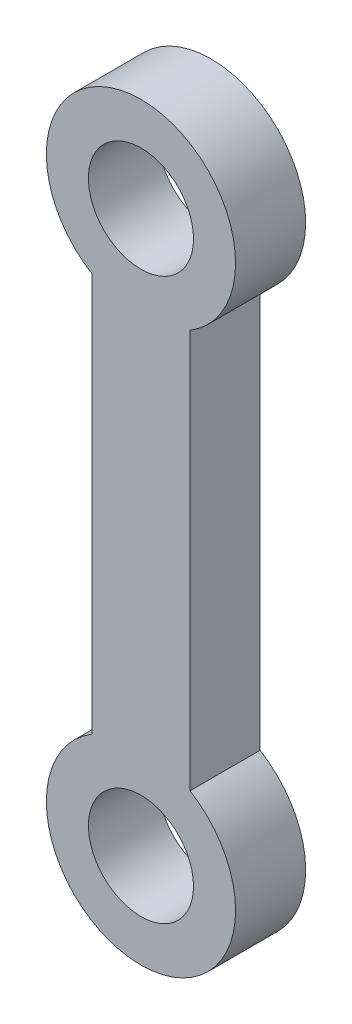
ISO-10303-21;
HEADER;
FILE_DESCRIPTION(('STEP AP214'),'2;1');
FILE_NAME('part.step','',(''),(''),'','','');
FILE_SCHEMA(('AUTOMOTIVE_DESIGN { 1 0 10303 214 1 1 1 1 }'));
ENDSEC;
DATA;
#1=APPLICATION_CONTEXT('core data for automotive mechanical design processes');
#2=APPLICATION_PROTOCOL_DEFINITION('international standard','automotive_design',2000,#1);
#3=PRODUCT_CONTEXT('',#1,'mechanical');
#4=PRODUCT('Part','Part','',(#3));
#5=PRODUCT_RELATED_PRODUCT_CATEGORY('part','',(#4));
#6=PRODUCT_DEFINITION_FORMATION('','',#4);
#7=PRODUCT_DEFINITION_CONTEXT('part definition',#1,'design');
#8=PRODUCT_DEFINITION('design','',#6,#7);
#9=PRODUCT_DEFINITION_SHAPE('','',#8);
#10=(LENGTH_UNIT() NAMED_UNIT(*) SI_UNIT(.MILLI.,.METRE.));
#11=(NAMED_UNIT(*) PLANE_ANGLE_UNIT() SI_UNIT($,.RADIAN.));
#12=(NAMED_UNIT(*) SI_UNIT($,.STERADIAN.) SOLID_ANGLE_UNIT());
#13=UNCERTAINTY_MEASURE_WITH_UNIT(LENGTH_MEASURE(1.E-05),#10,'distance_accuracy_value','');
#14=(GEOMETRIC_REPRESENTATION_CONTEXT(3) GLOBAL_UNCERTAINTY_ASSIGNED_CONTEXT((#13)) GLOBAL_UNIT_ASSIGNED_CONTEXT((#10,
#11,#12)) REPRESENTATION_CONTEXT('',''));
#15=CARTESIAN_POINT('',(0.,0.,0.));
#16=DIRECTION('',(0.,0.,1.));
#17=DIRECTION('',(1.,0.,0.));
#18=AXIS2_PLACEMENT_3D('',#15,#16,#17);
#19=CARTESIAN_POINT('',(-0.187959064612221,11.8120409353878,3.));
#20=DIRECTION('',(0.,0.,1.));
#21=DIRECTION('',(1.,0.,0.));
#22=AXIS2_PLACEMENT_3D('',#19,#20,#21);
#23=PLANE('',#22);
#24=CARTESIAN_POINT('',(-0.187959064612221,11.8120409353878,3.));
#25=DIRECTION('',(0.,0.,1.));
#26=DIRECTION('',(1.,0.,0.));
#27=AXIS2_PLACEMENT_3D('',#24,#25,#26);
#28=CIRCLE('',#27,2.25);
#29=CARTESIAN_POINT('',(2.06204093538778,11.8120409353878,3.));
#30=VERTEX_POINT('',#29);
#31=EDGE_CURVE('E106',#30,#30,#28,.T.);
#32=ORIENTED_EDGE('',*,*,#31,.F.);
#33=EDGE_LOOP('',(#32));
#34=FACE_BOUND('',#33,.T.);
#35=CARTESIAN_POINT('',(-0.187959064612221,11.8120409353878,3.));
#36=DIRECTION('',(0.,0.,1.));
#37=DIRECTION('',(1.,0.,0.));
#38=AXIS2_PLACEMENT_3D('',#35,#36,#37);
#39=CIRCLE('',#38,4.05);
#40=CARTESIAN_POINT('',(1.91204093538778,8.34902202120322,3.));
#41=VERTEX_POINT('',#40);
#42=CARTESIAN_POINT('',(-2.28795906461222,8.34902202120322,3.));
#43=VERTEX_POINT('',#42);
#44=EDGE_CURVE('E91',#41,#43,#39,.T.);
#45=ORIENTED_EDGE('',*,*,#44,.T.);
#46=DIRECTION('',(0.,-1.,0.));
#47=VECTOR('',#46,1.);
#48=CARTESIAN_POINT('',(-2.28795906461222,8.34902202120322,3.));
#49=LINE('',#48,#47);
#50=CARTESIAN_POINT('',(-2.28795906461222,-8.72494015042766,3.));
#51=VERTEX_POINT('',#50);
#52=EDGE_CURVE('E86',#43,#51,#49,.T.);
#53=ORIENTED_EDGE('',*,*,#52,.T.);
#54=CARTESIAN_POINT('',(-0.187959064612218,-12.1879590646122,3.));
#55=DIRECTION('',(0.,0.,1.));
#56=DIRECTION('',(1.,0.,0.));
#57=AXIS2_PLACEMENT_3D('',#54,#55,#56);
#58=CIRCLE('',#57,4.05);
#59=CARTESIAN_POINT('',(1.91204093538778,-8.72494015042766,3.));
#60=VERTEX_POINT('',#59);
#61=EDGE_CURVE('E87',#51,#60,#58,.T.);
#62=ORIENTED_EDGE('',*,*,#61,.T.);
#63=DIRECTION('',(0.,1.,0.));
#64=VECTOR('',#63,1.);
#65=CARTESIAN_POINT('',(1.91204093538778,8.34902202120322,3.));
#66=LINE('',#65,#64);
#67=EDGE_CURVE('E57',#60,#41,#66,.T.);
#68=ORIENTED_EDGE('',*,*,#67,.T.);
#69=EDGE_LOOP('',(#45,#53,#62,#68));
#70=FACE_BOUND('',#69,.T.);
#71=CARTESIAN_POINT('',(-0.187959064612218,-12.1879590646122,3.));
#72=DIRECTION('',(0.,0.,1.));
#73=DIRECTION('',(1.,0.,0.));
#74=AXIS2_PLACEMENT_3D('',#71,#72,#73);
#75=CIRCLE('',#74,2.25);
#76=CARTESIAN_POINT('',(2.06204093538778,-12.1879590646122,3.));
#77=VERTEX_POINT('',#76);
#78=EDGE_CURVE('E123',#77,#77,#75,.T.);
#79=ORIENTED_EDGE('',*,*,#78,.F.);
#80=EDGE_LOOP('',(#79));
#81=FACE_BOUND('',#80,.T.);
#82=ADVANCED_FACE('F39',(#34,#70,#81),#23,.T.);
#83=CARTESIAN_POINT('',(-0.187959064612221,11.8120409353878,0.));
#84=DIRECTION('',(0.,0.,1.));
#85=DIRECTION('',(1.,0.,0.));
#86=AXIS2_PLACEMENT_3D('',#83,#84,#85);
#87=PLANE('',#86);
#88=CARTESIAN_POINT('',(-0.187959064612221,11.8120409353878,0.));
#89=DIRECTION('',(0.,0.,1.));
#90=DIRECTION('',(1.,0.,0.));
#91=AXIS2_PLACEMENT_3D('',#88,#89,#90);
#92=CIRCLE('',#91,4.05);
#93=CARTESIAN_POINT('',(1.91204093538778,8.34902202120322,0.));
#94=VERTEX_POINT('',#93);
#95=CARTESIAN_POINT('',(-2.28795906461222,8.34902202120322,0.));
#96=VERTEX_POINT('',#95);
#97=EDGE_CURVE('E104',#94,#96,#92,.T.);
#98=ORIENTED_EDGE('',*,*,#97,.F.);
#99=DIRECTION('',(0.,1.,0.));
#100=VECTOR('',#99,1.);
#101=CARTESIAN_POINT('',(1.91204093538778,8.34902202120322,0.));
#102=LINE('',#101,#100);
#103=CARTESIAN_POINT('',(1.91204093538778,-8.72494015042766,0.));
#104=VERTEX_POINT('',#103);
#105=EDGE_CURVE('E80',#104,#94,#102,.T.);
#106=ORIENTED_EDGE('',*,*,#105,.F.);
#107=CARTESIAN_POINT('',(-0.187959064612218,-12.1879590646122,0.));
#108=DIRECTION('',(0.,0.,1.));
#109=DIRECTION('',(1.,0.,0.));
#110=AXIS2_PLACEMENT_3D('',#107,#108,#109);
#111=CIRCLE('',#110,4.05);
#112=CARTESIAN_POINT('',(-2.28795906461222,-8.72494015042766,0.));
#113=VERTEX_POINT('',#112);
#114=EDGE_CURVE('E74',#113,#104,#111,.T.);
#115=ORIENTED_EDGE('',*,*,#114,.F.);
#116=DIRECTION('',(0.,-1.,0.));
#117=VECTOR('',#116,1.);
#118=CARTESIAN_POINT('',(-2.28795906461222,8.34902202120322,0.));
#119=LINE('',#118,#117);
#120=EDGE_CURVE('E94',#96,#113,#119,.T.);
#121=ORIENTED_EDGE('',*,*,#120,.F.);
#122=EDGE_LOOP('',(#98,#106,#115,#121));
#123=FACE_BOUND('',#122,.T.);
#124=CARTESIAN_POINT('',(-0.187959064612221,11.8120409353878,0.));
#125=DIRECTION('',(0.,0.,1.));
#126=DIRECTION('',(1.,0.,0.));
#127=AXIS2_PLACEMENT_3D('',#124,#125,#126);
#128=CIRCLE('',#127,2.25);
#129=CARTESIAN_POINT('',(2.06204093538778,11.8120409353878,0.));
#130=VERTEX_POINT('',#129);
#131=EDGE_CURVE('E119',#130,#130,#128,.T.);
#132=ORIENTED_EDGE('',*,*,#131,.T.);
#133=EDGE_LOOP('',(#132));
#134=FACE_BOUND('',#133,.T.);
#135=CARTESIAN_POINT('',(-0.187959064612218,-12.1879590646122,0.));
#136=DIRECTION('',(0.,0.,1.));
#137=DIRECTION('',(1.,0.,0.));
#138=AXIS2_PLACEMENT_3D('',#135,#136,#137);
#139=CIRCLE('',#138,2.25);
#140=CARTESIAN_POINT('',(2.06204093538778,-12.1879590646122,0.));
#141=VERTEX_POINT('',#140);
#142=EDGE_CURVE('E125',#141,#141,#139,.T.);
#143=ORIENTED_EDGE('',*,*,#142,.T.);
#144=EDGE_LOOP('',(#143));
#145=FACE_BOUND('',#144,.T.);
#146=ADVANCED_FACE('F114',(#123,#134,#145),#87,.F.);
#147=CARTESIAN_POINT('',(-0.187959064612221,11.8120409353878,3.));
#148=DIRECTION('',(0.,0.,-1.));
#149=DIRECTION('',(-1.,0.,0.));
#150=AXIS2_PLACEMENT_3D('',#147,#148,#149);
#151=CYLINDRICAL_SURFACE('',#150,4.05);
#152=ORIENTED_EDGE('',*,*,#97,.T.);
#153=DIRECTION('',(0.,0.,-1.));
#154=VECTOR('',#153,1.);
#155=CARTESIAN_POINT('',(-2.28795906461222,8.34902202120322,3.));
#156=LINE('',#155,#154);
#157=EDGE_CURVE('E11',#43,#96,#156,.T.);
#158=ORIENTED_EDGE('',*,*,#157,.F.);
#159=ORIENTED_EDGE('',*,*,#44,.F.);
#160=DIRECTION('',(0.,0.,-1.));
#161=VECTOR('',#160,1.);
#162=CARTESIAN_POINT('',(1.91204093538778,8.34902202120322,3.));
#163=LINE('',#162,#161);
#164=EDGE_CURVE('E98',#41,#94,#163,.T.);
#165=ORIENTED_EDGE('',*,*,#164,.T.);
#166=EDGE_LOOP('',(#152,#158,#159,#165));
#167=FACE_BOUND('',#166,.T.);
#168=ADVANCED_FACE('F41',(#167),#151,.T.);
#169=CARTESIAN_POINT('',(-2.28795906461222,8.34902202120322,3.));
#170=DIRECTION('',(1.,0.,0.));
#171=DIRECTION('',(0.,1.,0.));
#172=AXIS2_PLACEMENT_3D('',#169,#170,#171);
#173=PLANE('',#172);
#174=ORIENTED_EDGE('',*,*,#120,.T.);
#175=DIRECTION('',(0.,0.,-1.));
#176=VECTOR('',#175,1.);
#177=CARTESIAN_POINT('',(-2.28795906461222,-8.72494015042766,3.));
#178=LINE('',#177,#176);
#179=EDGE_CURVE('E48',#51,#113,#178,.T.);
#180=ORIENTED_EDGE('',*,*,#179,.F.);
#181=ORIENTED_EDGE('',*,*,#52,.F.);
#182=ORIENTED_EDGE('',*,*,#157,.T.);
#183=EDGE_LOOP('',(#174,#180,#181,#182));
#184=FACE_BOUND('',#183,.T.);
#185=ADVANCED_FACE('F92',(#184),#173,.F.);
#186=CARTESIAN_POINT('',(-0.187959064612218,-12.1879590646122,3.));
#187=DIRECTION('',(0.,0.,-1.));
#188=DIRECTION('',(-1.,0.,0.));
#189=AXIS2_PLACEMENT_3D('',#186,#187,#188);
#190=CYLINDRICAL_SURFACE('',#189,4.05);
#191=ORIENTED_EDGE('',*,*,#114,.T.);
#192=DIRECTION('',(0.,0.,-1.));
#193=VECTOR('',#192,1.);
#194=CARTESIAN_POINT('',(1.91204093538778,-8.72494015042766,3.));
#195=LINE('',#194,#193);
#196=EDGE_CURVE('E96',#60,#104,#195,.T.);
#197=ORIENTED_EDGE('',*,*,#196,.F.);
#198=ORIENTED_EDGE('',*,*,#61,.F.);
#199=ORIENTED_EDGE('',*,*,#179,.T.);
#200=EDGE_LOOP('',(#191,#197,#198,#199));
#201=FACE_BOUND('',#200,.T.);
#202=ADVANCED_FACE('F100',(#201),#190,.T.);
#203=CARTESIAN_POINT('',(1.91204093538778,8.34902202120322,3.));
#204=DIRECTION('',(-1.,0.,0.));
#205=DIRECTION('',(0.,-1.,0.));
#206=AXIS2_PLACEMENT_3D('',#203,#204,#205);
#207=PLANE('',#206);
#208=ORIENTED_EDGE('',*,*,#105,.T.);
#209=ORIENTED_EDGE('',*,*,#164,.F.);
#210=ORIENTED_EDGE('',*,*,#67,.F.);
#211=ORIENTED_EDGE('',*,*,#196,.T.);
#212=EDGE_LOOP('',(#208,#209,#210,#211));
#213=FACE_BOUND('',#212,.T.);
#214=ADVANCED_FACE('F112',(#213),#207,.F.);
#215=CARTESIAN_POINT('',(-0.187959064612221,11.8120409353878,3.));
#216=DIRECTION('',(0.,0.,-1.));
#217=DIRECTION('',(-1.,0.,0.));
#218=AXIS2_PLACEMENT_3D('',#215,#216,#217);
#219=CYLINDRICAL_SURFACE('',#218,2.25);
#220=ORIENTED_EDGE('',*,*,#31,.T.);
#221=EDGE_LOOP('',(#220));
#222=FACE_BOUND('',#221,.T.);
#223=ORIENTED_EDGE('',*,*,#131,.F.);
#224=EDGE_LOOP('',(#223));
#225=FACE_BOUND('',#224,.T.);
#226=ADVANCED_FACE('F141',(#222,#225),#219,.F.);
#227=CARTESIAN_POINT('',(-0.187959064612218,-12.1879590646122,3.));
#228=DIRECTION('',(0.,0.,-1.));
#229=DIRECTION('',(-1.,0.,0.));
#230=AXIS2_PLACEMENT_3D('',#227,#228,#229);
#231=CYLINDRICAL_SURFACE('',#230,2.25);
#232=ORIENTED_EDGE('',*,*,#78,.T.);
#233=EDGE_LOOP('',(#232));
#234=FACE_BOUND('',#233,.T.);
#235=ORIENTED_EDGE('',*,*,#142,.F.);
#236=EDGE_LOOP('',(#235));
#237=FACE_BOUND('',#236,.T.);
#238=ADVANCED_FACE('F127',(#234,#237),#231,.F.);
#239=CLOSED_SHELL('',(#82,#146,#168,#185,#202,#214,#226,#238));
#240=MANIFOLD_SOLID_BREP('B2',#239);
#241=ADVANCED_BREP_SHAPE_REPRESENTATION('',(#18,#240),#14);
#242=SHAPE_DEFINITION_REPRESENTATION(#9,#241);
ENDSEC;
END-ISO-10303-21;
